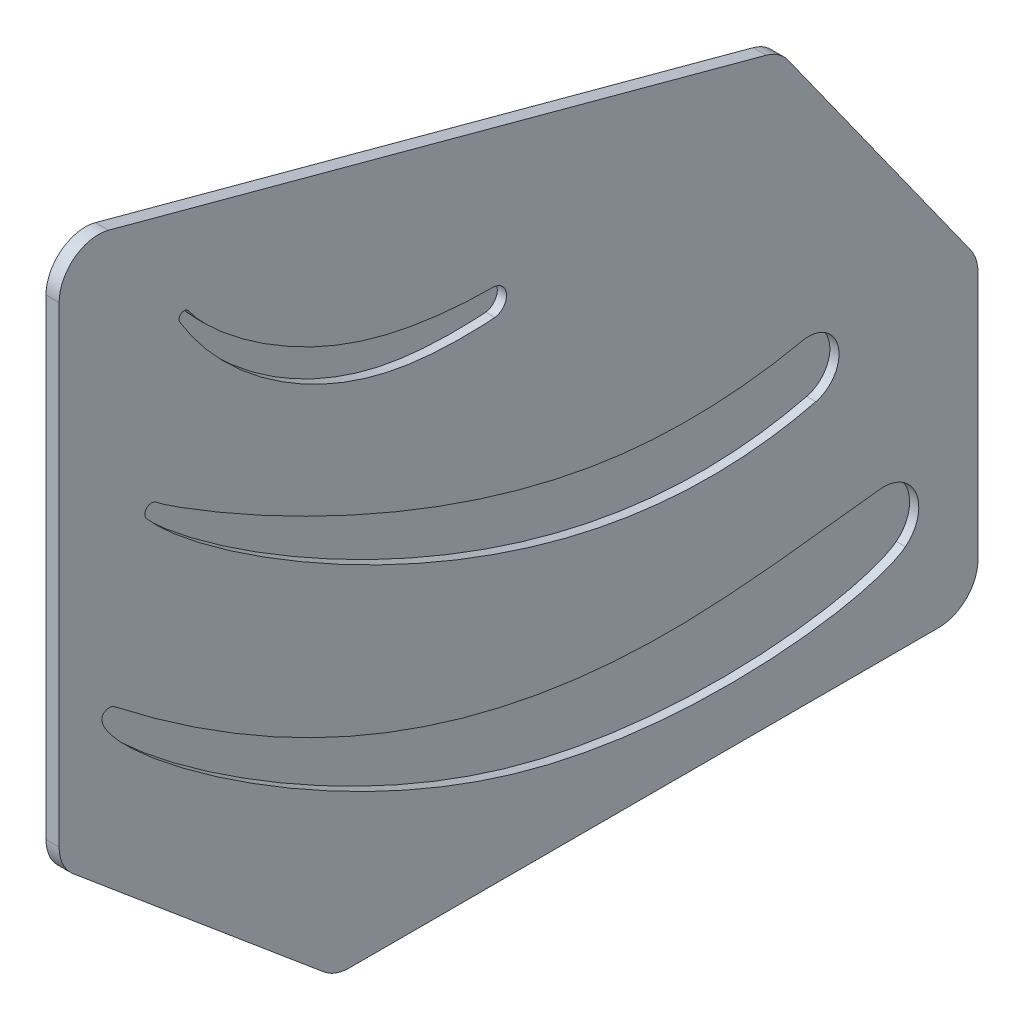
ISO-10303-21;
HEADER;
FILE_DESCRIPTION(('STEP AP214'),'2;1');
FILE_NAME('part.step','',(''),(''),'','','');
FILE_SCHEMA(('AUTOMOTIVE_DESIGN { 1 0 10303 214 1 1 1 1 }'));
ENDSEC;
DATA;
#1=APPLICATION_CONTEXT('core data for automotive mechanical design processes');
#2=APPLICATION_PROTOCOL_DEFINITION('international standard','automotive_design',2000,#1);
#3=PRODUCT_CONTEXT('',#1,'mechanical');
#4=PRODUCT('Part','Part','',(#3));
#5=PRODUCT_RELATED_PRODUCT_CATEGORY('part','',(#4));
#6=PRODUCT_DEFINITION_FORMATION('','',#4);
#7=PRODUCT_DEFINITION_CONTEXT('part definition',#1,'design');
#8=PRODUCT_DEFINITION('design','',#6,#7);
#9=PRODUCT_DEFINITION_SHAPE('','',#8);
#10=(LENGTH_UNIT() NAMED_UNIT(*) SI_UNIT(.MILLI.,.METRE.));
#11=(NAMED_UNIT(*) PLANE_ANGLE_UNIT() SI_UNIT($,.RADIAN.));
#12=(NAMED_UNIT(*) SI_UNIT($,.STERADIAN.) SOLID_ANGLE_UNIT());
#13=UNCERTAINTY_MEASURE_WITH_UNIT(LENGTH_MEASURE(1.E-05),#10,'distance_accuracy_value','');
#14=(GEOMETRIC_REPRESENTATION_CONTEXT(3) GLOBAL_UNCERTAINTY_ASSIGNED_CONTEXT((#13)) GLOBAL_UNIT_ASSIGNED_CONTEXT((#10,
#11,#12)) REPRESENTATION_CONTEXT('',''));
#15=CARTESIAN_POINT('',(0.,0.,0.));
#16=DIRECTION('',(0.,0.,1.));
#17=DIRECTION('',(1.,0.,0.));
#18=AXIS2_PLACEMENT_3D('',#15,#16,#17);
#19=CARTESIAN_POINT('',(10.,-174.517122226006,-532.073894018374));
#20=DIRECTION('',(-1.,0.,0.));
#21=DIRECTION('',(0.,0.,1.));
#22=AXIS2_PLACEMENT_3D('',#19,#20,#21);
#23=CYLINDRICAL_SURFACE('',#22,30.0000000000001);
#24=CARTESIAN_POINT('',(0.,-174.517122226006,-532.073894018374));
#25=DIRECTION('',(1.,0.,0.));
#26=DIRECTION('',(0.,0.,1.));
#27=AXIS2_PLACEMENT_3D('',#24,#25,#26);
#28=CIRCLE('',#27,30.0000000000001);
#29=CARTESIAN_POINT('',(0.,-157.087470130835,-556.491249072542));
#30=VERTEX_POINT('',#29);
#31=CARTESIAN_POINT('',(0.,-145.551320648023,-539.883012979237));
#32=VERTEX_POINT('',#31);
#33=EDGE_CURVE('E401',#30,#32,#28,.T.);
#34=ORIENTED_EDGE('',*,*,#33,.T.);
#35=DIRECTION('',(-1.,0.,0.));
#36=VECTOR('',#35,1.);
#37=CARTESIAN_POINT('',(10.,-145.551320648023,-539.883012979237));
#38=LINE('',#37,#36);
#39=CARTESIAN_POINT('',(10.,-145.551320648023,-539.883012979237));
#40=VERTEX_POINT('',#39);
#41=EDGE_CURVE('E11',#40,#32,#38,.T.);
#42=ORIENTED_EDGE('',*,*,#41,.F.);
#43=CARTESIAN_POINT('',(10.,-174.517122226006,-532.073894018374));
#44=DIRECTION('',(1.,0.,0.));
#45=DIRECTION('',(0.,0.,1.));
#46=AXIS2_PLACEMENT_3D('',#43,#44,#45);
#47=CIRCLE('',#46,30.0000000000001);
#48=CARTESIAN_POINT('',(10.,-157.087470130835,-556.491249072542));
#49=VERTEX_POINT('',#48);
#50=EDGE_CURVE('E441',#49,#40,#47,.T.);
#51=ORIENTED_EDGE('',*,*,#50,.F.);
#52=DIRECTION('',(-1.,0.,0.));
#53=VECTOR('',#52,1.);
#54=CARTESIAN_POINT('',(10.,-157.087470130835,-556.491249072542));
#55=LINE('',#54,#53);
#56=EDGE_CURVE('E442',#49,#30,#55,.T.);
#57=ORIENTED_EDGE('',*,*,#56,.T.);
#58=EDGE_LOOP('',(#34,#42,#51,#57));
#59=FACE_BOUND('',#58,.T.);
#60=ADVANCED_FACE('F39',(#59),#23,.T.);
#61=CARTESIAN_POINT('',(10.,-145.551320648023,-539.883012979237));
#62=DIRECTION('',(0.,-0.965526719266104,0.260303965362101));
#63=DIRECTION('',(0.,-0.260303965362101,-0.965526719266104));
#64=AXIS2_PLACEMENT_3D('',#61,#62,#63);
#65=PLANE('',#64);
#66=DIRECTION('',(0.,0.260303965362101,0.965526719266104));
#67=VECTOR('',#66,1.);
#68=CARTESIAN_POINT('',(0.,-145.551320648023,-539.883012979237));
#69=LINE('',#68,#67);
#70=CARTESIAN_POINT('',(0.,-10.1932586597301,-37.8091189608631));
#71=VERTEX_POINT('',#70);
#72=EDGE_CURVE('E392',#32,#71,#69,.T.);
#73=ORIENTED_EDGE('',*,*,#72,.T.);
#74=DIRECTION('',(-1.,0.,0.));
#75=VECTOR('',#74,1.);
#76=CARTESIAN_POINT('',(10.,-10.1932586597301,-37.8091189608631));
#77=LINE('',#76,#75);
#78=CARTESIAN_POINT('',(10.,-10.1932586597301,-37.8091189608631));
#79=VERTEX_POINT('',#78);
#80=EDGE_CURVE('E47',#79,#71,#77,.T.);
#81=ORIENTED_EDGE('',*,*,#80,.F.);
#82=DIRECTION('',(0.,0.260303965362101,0.965526719266104));
#83=VECTOR('',#82,1.);
#84=CARTESIAN_POINT('',(10.,-145.551320648023,-539.883012979237));
#85=LINE('',#84,#83);
#86=EDGE_CURVE('E492',#40,#79,#85,.T.);
#87=ORIENTED_EDGE('',*,*,#86,.F.);
#88=ORIENTED_EDGE('',*,*,#41,.T.);
#89=EDGE_LOOP('',(#73,#81,#87,#88));
#90=FACE_BOUND('',#89,.T.);
#91=ADVANCED_FACE('F383',(#90),#65,.F.);
#92=CARTESIAN_POINT('',(10.,-39.1590602377132,-30.));
#93=DIRECTION('',(-1.,0.,0.));
#94=DIRECTION('',(0.,0.,1.));
#95=AXIS2_PLACEMENT_3D('',#92,#93,#94);
#96=CYLINDRICAL_SURFACE('',#95,30.);
#97=CARTESIAN_POINT('',(0.,-39.1590602377132,-30.));
#98=DIRECTION('',(1.,0.,0.));
#99=DIRECTION('',(0.,0.,1.));
#100=AXIS2_PLACEMENT_3D('',#97,#98,#99);
#101=CIRCLE('',#100,30.);
#102=CARTESIAN_POINT('',(0.,-39.1590602377132,0.));
#103=VERTEX_POINT('',#102);
#104=EDGE_CURVE('E400',#71,#103,#101,.T.);
#105=ORIENTED_EDGE('',*,*,#104,.T.);
#106=DIRECTION('',(-1.,0.,0.));
#107=VECTOR('',#106,1.);
#108=CARTESIAN_POINT('',(10.,-39.1590602377132,0.));
#109=LINE('',#108,#107);
#110=CARTESIAN_POINT('',(10.,-39.1590602377132,0.));
#111=VERTEX_POINT('',#110);
#112=EDGE_CURVE('E407',#111,#103,#109,.T.);
#113=ORIENTED_EDGE('',*,*,#112,.F.);
#114=CARTESIAN_POINT('',(10.,-39.1590602377132,-30.));
#115=DIRECTION('',(1.,0.,0.));
#116=DIRECTION('',(0.,0.,1.));
#117=AXIS2_PLACEMENT_3D('',#114,#115,#116);
#118=CIRCLE('',#117,30.);
#119=EDGE_CURVE('E405',#79,#111,#118,.T.);
#120=ORIENTED_EDGE('',*,*,#119,.F.);
#121=ORIENTED_EDGE('',*,*,#80,.T.);
#122=EDGE_LOOP('',(#105,#113,#120,#121));
#123=FACE_BOUND('',#122,.T.);
#124=ADVANCED_FACE('F380',(#123),#96,.T.);
#125=CARTESIAN_POINT('',(10.,-39.1590602377132,0.));
#126=DIRECTION('',(0.,0.,-1.));
#127=DIRECTION('',(0.,1.,0.));
#128=AXIS2_PLACEMENT_3D('',#125,#126,#127);
#129=PLANE('',#128);
#130=DIRECTION('',(0.,-1.,0.));
#131=VECTOR('',#130,1.);
#132=CARTESIAN_POINT('',(0.,-39.1590602377132,0.));
#133=LINE('',#132,#131);
#134=CARTESIAN_POINT('',(0.,-399.159060237713,0.));
#135=VERTEX_POINT('',#134);
#136=EDGE_CURVE('E410',#103,#135,#133,.T.);
#137=ORIENTED_EDGE('',*,*,#136,.T.);
#138=DIRECTION('',(-1.,0.,0.));
#139=VECTOR('',#138,1.);
#140=CARTESIAN_POINT('',(10.,-399.159060237713,0.));
#141=LINE('',#140,#139);
#142=CARTESIAN_POINT('',(10.,-399.159060237713,0.));
#143=VERTEX_POINT('',#142);
#144=EDGE_CURVE('E475',#143,#135,#141,.T.);
#145=ORIENTED_EDGE('',*,*,#144,.F.);
#146=DIRECTION('',(0.,-1.,0.));
#147=VECTOR('',#146,1.);
#148=CARTESIAN_POINT('',(10.,-39.1590602377132,0.));
#149=LINE('',#148,#147);
#150=EDGE_CURVE('E482',#111,#143,#149,.T.);
#151=ORIENTED_EDGE('',*,*,#150,.F.);
#152=ORIENTED_EDGE('',*,*,#112,.T.);
#153=EDGE_LOOP('',(#137,#145,#151,#152));
#154=FACE_BOUND('',#153,.T.);
#155=ADVANCED_FACE('F376',(#154),#129,.F.);
#156=CARTESIAN_POINT('',(10.,-399.159060237713,-29.9999999999999));
#157=DIRECTION('',(-1.,0.,0.));
#158=DIRECTION('',(0.,0.,1.));
#159=AXIS2_PLACEMENT_3D('',#156,#157,#158);
#160=CYLINDRICAL_SURFACE('',#159,30.);
#161=CARTESIAN_POINT('',(0.,-399.159060237713,-29.9999999999999));
#162=DIRECTION('',(1.,0.,0.));
#163=DIRECTION('',(0.,0.,1.));
#164=AXIS2_PLACEMENT_3D('',#161,#162,#163);
#165=CIRCLE('',#164,30.);
#166=CARTESIAN_POINT('',(0.,-422.140393531283,-10.7163717094038));
#167=VERTEX_POINT('',#166);
#168=EDGE_CURVE('E414',#135,#167,#165,.T.);
#169=ORIENTED_EDGE('',*,*,#168,.T.);
#170=DIRECTION('',(-1.,0.,0.));
#171=VECTOR('',#170,1.);
#172=CARTESIAN_POINT('',(10.,-422.140393531283,-10.7163717094038));
#173=LINE('',#172,#171);
#174=CARTESIAN_POINT('',(10.,-422.140393531283,-10.7163717094038));
#175=VERTEX_POINT('',#174);
#176=EDGE_CURVE('E471',#175,#167,#173,.T.);
#177=ORIENTED_EDGE('',*,*,#176,.F.);
#178=CARTESIAN_POINT('',(10.,-399.159060237713,-29.9999999999999));
#179=DIRECTION('',(1.,0.,0.));
#180=DIRECTION('',(0.,0.,1.));
#181=AXIS2_PLACEMENT_3D('',#178,#179,#180);
#182=CIRCLE('',#181,30.);
#183=EDGE_CURVE('E486',#143,#175,#182,.T.);
#184=ORIENTED_EDGE('',*,*,#183,.F.);
#185=ORIENTED_EDGE('',*,*,#144,.T.);
#186=EDGE_LOOP('',(#169,#177,#184,#185));
#187=FACE_BOUND('',#186,.T.);
#188=ADVANCED_FACE('F372',(#187),#160,.T.);
#189=CARTESIAN_POINT('',(10.,-422.140393531283,-10.7163717094038));
#190=DIRECTION('',(0.,0.76604444311898,-0.642787609686537));
#191=DIRECTION('',(0.,0.642787609686537,0.76604444311898));
#192=AXIS2_PLACEMENT_3D('',#189,#190,#191);
#193=PLANE('',#192);
#194=DIRECTION('',(0.,-0.642787609686537,-0.76604444311898));
#195=VECTOR('',#194,1.);
#196=CARTESIAN_POINT('',(0.,-422.140393531283,-10.7163717094038));
#197=LINE('',#196,#195);
#198=CARTESIAN_POINT('',(0.,-582.837295952917,-202.227482489149));
#199=VERTEX_POINT('',#198);
#200=EDGE_CURVE('E420',#167,#199,#197,.T.);
#201=ORIENTED_EDGE('',*,*,#200,.T.);
#202=DIRECTION('',(-1.,0.,0.));
#203=VECTOR('',#202,1.);
#204=CARTESIAN_POINT('',(10.,-582.837295952917,-202.227482489149));
#205=LINE('',#204,#203);
#206=CARTESIAN_POINT('',(10.,-582.837295952917,-202.227482489149));
#207=VERTEX_POINT('',#206);
#208=EDGE_CURVE('E467',#207,#199,#205,.T.);
#209=ORIENTED_EDGE('',*,*,#208,.F.);
#210=DIRECTION('',(0.,-0.642787609686537,-0.76604444311898));
#211=VECTOR('',#210,1.);
#212=CARTESIAN_POINT('',(10.,-422.140393531283,-10.7163717094038));
#213=LINE('',#212,#211);
#214=EDGE_CURVE('E490',#175,#207,#213,.T.);
#215=ORIENTED_EDGE('',*,*,#214,.F.);
#216=ORIENTED_EDGE('',*,*,#176,.T.);
#217=EDGE_LOOP('',(#201,#209,#215,#216));
#218=FACE_BOUND('',#217,.T.);
#219=ADVANCED_FACE('F368',(#218),#193,.F.);
#220=CARTESIAN_POINT('',(10.,-559.855962659348,-221.511110779745));
#221=DIRECTION('',(-1.,0.,0.));
#222=DIRECTION('',(0.,0.,1.));
#223=AXIS2_PLACEMENT_3D('',#220,#221,#222);
#224=CYLINDRICAL_SURFACE('',#223,30.);
#225=CARTESIAN_POINT('',(0.,-559.855962659348,-221.511110779745));
#226=DIRECTION('',(1.,0.,0.));
#227=DIRECTION('',(0.,0.,1.));
#228=AXIS2_PLACEMENT_3D('',#225,#226,#227);
#229=CIRCLE('',#228,30.);
#230=CARTESIAN_POINT('',(0.,-589.855962659348,-221.511110779745));
#231=VERTEX_POINT('',#230);
#232=EDGE_CURVE('E423',#199,#231,#229,.T.);
#233=ORIENTED_EDGE('',*,*,#232,.T.);
#234=DIRECTION('',(-1.,0.,0.));
#235=VECTOR('',#234,1.);
#236=CARTESIAN_POINT('',(10.,-589.855962659348,-221.511110779745));
#237=LINE('',#236,#235);
#238=CARTESIAN_POINT('',(10.,-589.855962659348,-221.511110779745));
#239=VERTEX_POINT('',#238);
#240=EDGE_CURVE('E463',#239,#231,#237,.T.);
#241=ORIENTED_EDGE('',*,*,#240,.F.);
#242=CARTESIAN_POINT('',(10.,-559.855962659348,-221.511110779745));
#243=DIRECTION('',(1.,0.,0.));
#244=DIRECTION('',(0.,0.,1.));
#245=AXIS2_PLACEMENT_3D('',#242,#243,#244);
#246=CIRCLE('',#245,30.);
#247=EDGE_CURVE('E498',#207,#239,#246,.T.);
#248=ORIENTED_EDGE('',*,*,#247,.F.);
#249=ORIENTED_EDGE('',*,*,#208,.T.);
#250=EDGE_LOOP('',(#233,#241,#248,#249));
#251=FACE_BOUND('',#250,.T.);
#252=ADVANCED_FACE('F364',(#251),#224,.T.);
#253=CARTESIAN_POINT('',(10.,-589.855962659348,-221.511110779745));
#254=DIRECTION('',(0.,1.,0.));
#255=DIRECTION('',(0.,0.,1.));
#256=AXIS2_PLACEMENT_3D('',#253,#254,#255);
#257=PLANE('',#256);
#258=DIRECTION('',(0.,0.,-1.));
#259=VECTOR('',#258,1.);
#260=CARTESIAN_POINT('',(0.,-589.855962659348,-221.511110779745));
#261=LINE('',#260,#259);
#262=CARTESIAN_POINT('',(0.,-589.855962659348,-671.511110779745));
#263=VERTEX_POINT('',#262);
#264=EDGE_CURVE('E426',#231,#263,#261,.T.);
#265=ORIENTED_EDGE('',*,*,#264,.T.);
#266=DIRECTION('',(-1.,0.,0.));
#267=VECTOR('',#266,1.);
#268=CARTESIAN_POINT('',(10.,-589.855962659348,-671.511110779745));
#269=LINE('',#268,#267);
#270=CARTESIAN_POINT('',(10.,-589.855962659348,-671.511110779745));
#271=VERTEX_POINT('',#270);
#272=EDGE_CURVE('E459',#271,#263,#269,.T.);
#273=ORIENTED_EDGE('',*,*,#272,.F.);
#274=DIRECTION('',(0.,0.,-1.));
#275=VECTOR('',#274,1.);
#276=CARTESIAN_POINT('',(10.,-589.855962659348,-221.511110779745));
#277=LINE('',#276,#275);
#278=EDGE_CURVE('E501',#239,#271,#277,.T.);
#279=ORIENTED_EDGE('',*,*,#278,.F.);
#280=ORIENTED_EDGE('',*,*,#240,.T.);
#281=EDGE_LOOP('',(#265,#273,#279,#280));
#282=FACE_BOUND('',#281,.T.);
#283=ADVANCED_FACE('F360',(#282),#257,.F.);
#284=CARTESIAN_POINT('',(10.,-559.855962659348,-671.511110779745));
#285=DIRECTION('',(-1.,0.,0.));
#286=DIRECTION('',(0.,0.,1.));
#287=AXIS2_PLACEMENT_3D('',#284,#285,#286);
#288=CYLINDRICAL_SURFACE('',#287,30.0000000000001);
#289=CARTESIAN_POINT('',(0.,-559.855962659348,-671.511110779745));
#290=DIRECTION('',(1.,0.,0.));
#291=DIRECTION('',(0.,0.,1.));
#292=AXIS2_PLACEMENT_3D('',#289,#290,#291);
#293=CIRCLE('',#292,30.0000000000001);
#294=CARTESIAN_POINT('',(0.,-559.855962659348,-701.511110779745));
#295=VERTEX_POINT('',#294);
#296=EDGE_CURVE('E429',#263,#295,#293,.T.);
#297=ORIENTED_EDGE('',*,*,#296,.T.);
#298=DIRECTION('',(-1.,0.,0.));
#299=VECTOR('',#298,1.);
#300=CARTESIAN_POINT('',(10.,-559.855962659348,-701.511110779745));
#301=LINE('',#300,#299);
#302=CARTESIAN_POINT('',(10.,-559.855962659348,-701.511110779745));
#303=VERTEX_POINT('',#302);
#304=EDGE_CURVE('E455',#303,#295,#301,.T.);
#305=ORIENTED_EDGE('',*,*,#304,.F.);
#306=CARTESIAN_POINT('',(10.,-559.855962659348,-671.511110779745));
#307=DIRECTION('',(1.,0.,0.));
#308=DIRECTION('',(0.,0.,1.));
#309=AXIS2_PLACEMENT_3D('',#306,#307,#308);
#310=CIRCLE('',#309,30.0000000000001);
#311=EDGE_CURVE('E504',#271,#303,#310,.T.);
#312=ORIENTED_EDGE('',*,*,#311,.F.);
#313=ORIENTED_EDGE('',*,*,#272,.T.);
#314=EDGE_LOOP('',(#297,#305,#312,#313));
#315=FACE_BOUND('',#314,.T.);
#316=ADVANCED_FACE('F356',(#315),#288,.T.);
#317=CARTESIAN_POINT('',(10.,-559.855962659348,-701.511110779745));
#318=DIRECTION('',(0.,0.,1.));
#319=DIRECTION('',(0.,-1.,0.));
#320=AXIS2_PLACEMENT_3D('',#317,#318,#319);
#321=PLANE('',#320);
#322=DIRECTION('',(0.,1.,0.));
#323=VECTOR('',#322,1.);
#324=CARTESIAN_POINT('',(0.,-559.855962659348,-701.511110779745));
#325=LINE('',#324,#323);
#326=CARTESIAN_POINT('',(0.,-369.855962659348,-701.511110779745));
#327=VERTEX_POINT('',#326);
#328=EDGE_CURVE('E432',#295,#327,#325,.T.);
#329=ORIENTED_EDGE('',*,*,#328,.T.);
#330=DIRECTION('',(-1.,0.,0.));
#331=VECTOR('',#330,1.);
#332=CARTESIAN_POINT('',(10.,-369.855962659348,-701.511110779745));
#333=LINE('',#332,#331);
#334=CARTESIAN_POINT('',(10.,-369.855962659348,-701.511110779745));
#335=VERTEX_POINT('',#334);
#336=EDGE_CURVE('E451',#335,#327,#333,.T.);
#337=ORIENTED_EDGE('',*,*,#336,.F.);
#338=DIRECTION('',(0.,1.,0.));
#339=VECTOR('',#338,1.);
#340=CARTESIAN_POINT('',(10.,-559.855962659348,-701.511110779745));
#341=LINE('',#340,#339);
#342=EDGE_CURVE('E507',#303,#335,#341,.T.);
#343=ORIENTED_EDGE('',*,*,#342,.F.);
#344=ORIENTED_EDGE('',*,*,#304,.T.);
#345=EDGE_LOOP('',(#329,#337,#343,#344));
#346=FACE_BOUND('',#345,.T.);
#347=ADVANCED_FACE('F352',(#346),#321,.F.);
#348=CARTESIAN_POINT('',(10.,-369.855962659348,-671.511110779745));
#349=DIRECTION('',(-1.,0.,0.));
#350=DIRECTION('',(0.,0.,1.));
#351=AXIS2_PLACEMENT_3D('',#348,#349,#350);
#352=CYLINDRICAL_SURFACE('',#351,30.);
#353=CARTESIAN_POINT('',(0.,-369.855962659348,-671.511110779745));
#354=DIRECTION('',(1.,0.,0.));
#355=DIRECTION('',(0.,0.,1.));
#356=AXIS2_PLACEMENT_3D('',#353,#354,#355);
#357=CIRCLE('',#356,30.);
#358=CARTESIAN_POINT('',(0.,-352.426310564176,-695.928465833913));
#359=VERTEX_POINT('',#358);
#360=EDGE_CURVE('E435',#327,#359,#357,.T.);
#361=ORIENTED_EDGE('',*,*,#360,.T.);
#362=DIRECTION('',(-1.,0.,0.));
#363=VECTOR('',#362,1.);
#364=CARTESIAN_POINT('',(10.,-352.426310564176,-695.928465833913));
#365=LINE('',#364,#363);
#366=CARTESIAN_POINT('',(10.,-352.426310564176,-695.928465833913));
#367=VERTEX_POINT('',#366);
#368=EDGE_CURVE('E446',#367,#359,#365,.T.);
#369=ORIENTED_EDGE('',*,*,#368,.F.);
#370=CARTESIAN_POINT('',(10.,-369.855962659348,-671.511110779745));
#371=DIRECTION('',(1.,0.,0.));
#372=DIRECTION('',(0.,0.,1.));
#373=AXIS2_PLACEMENT_3D('',#370,#371,#372);
#374=CIRCLE('',#373,30.);
#375=EDGE_CURVE('E510',#335,#367,#374,.T.);
#376=ORIENTED_EDGE('',*,*,#375,.F.);
#377=ORIENTED_EDGE('',*,*,#336,.T.);
#378=EDGE_LOOP('',(#361,#369,#376,#377));
#379=FACE_BOUND('',#378,.T.);
#380=ADVANCED_FACE('F348',(#379),#352,.T.);
#381=CARTESIAN_POINT('',(10.,-352.426310564176,-695.928465833913));
#382=DIRECTION('',(0.,-0.580988403172377,0.813911835138924));
#383=DIRECTION('',(0.,-0.813911835138924,-0.580988403172377));
#384=AXIS2_PLACEMENT_3D('',#381,#382,#383);
#385=PLANE('',#384);
#386=DIRECTION('',(0.,0.813911835138924,0.580988403172377));
#387=VECTOR('',#386,1.);
#388=CARTESIAN_POINT('',(0.,-352.426310564176,-695.928465833913));
#389=LINE('',#388,#387);
#390=EDGE_CURVE('E438',#359,#30,#389,.T.);
#391=ORIENTED_EDGE('',*,*,#390,.T.);
#392=ORIENTED_EDGE('',*,*,#56,.F.);
#393=DIRECTION('',(0.,0.813911835138924,0.580988403172377));
#394=VECTOR('',#393,1.);
#395=CARTESIAN_POINT('',(10.,-352.426310564176,-695.928465833913));
#396=LINE('',#395,#394);
#397=EDGE_CURVE('E447',#367,#49,#396,.T.);
#398=ORIENTED_EDGE('',*,*,#397,.F.);
#399=ORIENTED_EDGE('',*,*,#368,.T.);
#400=EDGE_LOOP('',(#391,#392,#398,#399));
#401=FACE_BOUND('',#400,.T.);
#402=ADVANCED_FACE('F341',(#401),#385,.F.);
#403=CARTESIAN_POINT('',(10.,-174.517122226006,-532.073894018374));
#404=DIRECTION('',(-1.,0.,0.));
#405=DIRECTION('',(0.,0.,1.));
#406=AXIS2_PLACEMENT_3D('',#403,#404,#405);
#407=PLANE('',#406);
#408=CARTESIAN_POINT('',(10.,-502.589093221436,-629.491772363447));
#409=DIRECTION('',(1.,0.,0.));
#410=DIRECTION('',(0.,0.,-1.));
#411=AXIS2_PLACEMENT_3D('',#408,#409,#410);
#412=CIRCLE('',#411,26.8241570867148);
#413=CARTESIAN_POINT('',(10.,-523.626722446305,-646.133694127765));
#414=VERTEX_POINT('',#413);
#415=CARTESIAN_POINT('',(10.,-475.947865393782,-626.364411935255));
#416=VERTEX_POINT('',#415);
#417=EDGE_CURVE('E281',#414,#416,#412,.T.);
#418=ORIENTED_EDGE('',*,*,#417,.F.);
#419=CARTESIAN_POINT('',(10.,-327.560917885921,-34.2073928975711));
#420=CARTESIAN_POINT('',(10.,-342.918185901168,-14.4757134824389));
#421=CARTESIAN_POINT('',(10.,-589.015611508737,-324.808789115096));
#422=CARTESIAN_POINT('',(10.,-544.090123726999,-620.26520039731));
#423=CARTESIAN_POINT('',(10.,-523.626722446305,-646.133694127765));
#424=B_SPLINE_CURVE_WITH_KNOTS('',3,(#419,#420,#421,#422,#423),.UNSPECIFIED.,.F.,.F.,(4,1,4),
(0.,0.545719306993934,1.),.UNSPECIFIED.);
#425=CARTESIAN_POINT('',(10.,-327.560917885921,-34.2073928975711));
#426=VERTEX_POINT('',#425);
#427=EDGE_CURVE('E54',#426,#414,#424,.T.);
#428=ORIENTED_EDGE('',*,*,#427,.F.);
#429=CARTESIAN_POINT('',(10.,-332.821595277872,-38.3018052864112));
#430=DIRECTION('',(1.,0.,0.));
#431=DIRECTION('',(0.,0.,-1.));
#432=AXIS2_PLACEMENT_3D('',#429,#430,#431);
#433=CIRCLE('',#432,6.66625377795278);
#434=CARTESIAN_POINT('',(10.,-327.560917885921,-42.3962176752514));
#435=VERTEX_POINT('',#434);
#436=EDGE_CURVE('E295',#435,#426,#433,.T.);
#437=ORIENTED_EDGE('',*,*,#436,.F.);
#438=CARTESIAN_POINT('',(10.,-475.947865393782,-626.364411935255));
#439=CARTESIAN_POINT('',(10.,-482.27942538639,-572.427382244999));
#440=CARTESIAN_POINT('',(10.,-510.067463813898,-369.496171973337));
#441=CARTESIAN_POINT('',(10.,-434.657283692067,-179.998241323893));
#442=CARTESIAN_POINT('',(10.,-327.560917885921,-42.3962176752514));
#443=B_SPLINE_CURVE_WITH_KNOTS('',3,(#438,#439,#440,#441,#442),.UNSPECIFIED.,.F.,.F.,(4,1,4),
(0.,0.257311007097381,1.),.UNSPECIFIED.);
#444=EDGE_CURVE('E289',#416,#435,#443,.T.);
#445=ORIENTED_EDGE('',*,*,#444,.F.);
#446=EDGE_LOOP('',(#418,#428,#437,#445));
#447=FACE_BOUND('',#446,.T.);
#448=CARTESIAN_POINT('',(10.,-212.017093403613,-70.6350047953519));
#449=DIRECTION('',(1.,0.,0.));
#450=DIRECTION('',(0.,0.,-1.));
#451=AXIS2_PLACEMENT_3D('',#448,#449,#450);
#452=CIRCLE('',#451,5.16343894993929);
#453=CARTESIAN_POINT('',(10.,-208.284508838147,-74.2027651924913));
#454=VERTEX_POINT('',#453);
#455=CARTESIAN_POINT('',(10.,-215.359019498053,-66.6989367358474));
#456=VERTEX_POINT('',#455);
#457=EDGE_CURVE('E731',#454,#456,#452,.T.);
#458=ORIENTED_EDGE('',*,*,#457,.F.);
#459=CARTESIAN_POINT('',(10.,-348.175125637554,-567.085033992223));
#460=CARTESIAN_POINT('',(10.,-357.109499900645,-526.742508557986));
#461=CARTESIAN_POINT('',(10.,-369.790908175434,-316.076431581436));
#462=CARTESIAN_POINT('',(10.,-214.924232146977,-81.1492318782514));
#463=CARTESIAN_POINT('',(10.,-208.284508838147,-74.2027651924913));
#464=B_SPLINE_CURVE_WITH_KNOTS('',3,(#459,#460,#461,#462,#463),.UNSPECIFIED.,.F.,.F.,(4,1,4),
(0.,0.231564943098002,1.),.UNSPECIFIED.);
#465=CARTESIAN_POINT('',(10.,-348.175125637554,-567.085033992223));
#466=VERTEX_POINT('',#465);
#467=EDGE_CURVE('E62',#466,#454,#464,.T.);
#468=ORIENTED_EDGE('',*,*,#467,.F.);
#469=CARTESIAN_POINT('',(10.,-370.921108440947,-572.122426202053));
#470=DIRECTION('',(1.,0.,0.));
#471=DIRECTION('',(0.,0.,-1.));
#472=AXIS2_PLACEMENT_3D('',#469,#470,#471);
#473=CIRCLE('',#472,23.2971039824244);
#474=CARTESIAN_POINT('',(10.,-393.526935767269,-577.755509270889));
#475=VERTEX_POINT('',#474);
#476=EDGE_CURVE('E223',#475,#466,#473,.T.);
#477=ORIENTED_EDGE('',*,*,#476,.F.);
#478=CARTESIAN_POINT('',(10.,-215.359019498053,-66.6989367358474));
#479=CARTESIAN_POINT('',(10.,-254.957400327833,-100.32001751799));
#480=CARTESIAN_POINT('',(10.,-390.035120939274,-300.322217314818));
#481=CARTESIAN_POINT('',(10.,-410.500517765273,-509.639726303154));
#482=CARTESIAN_POINT('',(10.,-393.526935767269,-577.755509270889));
#483=B_SPLINE_CURVE_WITH_KNOTS('',3,(#478,#479,#480,#481,#482),.UNSPECIFIED.,.F.,.F.,(4,1,4),
(0.,0.654710404601049,1.),.UNSPECIFIED.);
#484=EDGE_CURVE('E227',#456,#475,#483,.T.);
#485=ORIENTED_EDGE('',*,*,#484,.F.);
#486=EDGE_LOOP('',(#458,#468,#477,#485));
#487=FACE_BOUND('',#486,.T.);
#488=CARTESIAN_POINT('',(10.,-205.077593488352,-331.180679607639));
#489=DIRECTION('',(1.,0.,0.));
#490=DIRECTION('',(0.,0.,-1.));
#491=AXIS2_PLACEMENT_3D('',#488,#489,#490);
#492=CIRCLE('',#491,10.3921258794981);
#493=CARTESIAN_POINT('',(10.,-215.359019498053,-332.693478173995));
#494=VERTEX_POINT('',#493);
#495=CARTESIAN_POINT('',(10.,-194.685467652383,-331.179728440837));
#496=VERTEX_POINT('',#495);
#497=EDGE_CURVE('E580',#494,#496,#492,.T.);
#498=ORIENTED_EDGE('',*,*,#497,.F.);
#499=CARTESIAN_POINT('',(10.,-98.1982205957029,-92.1634139046647));
#500=CARTESIAN_POINT('',(10.,-154.802617957198,-126.325036043108));
#501=CARTESIAN_POINT('',(10.,-224.562098264762,-226.918714052244));
#502=CARTESIAN_POINT('',(10.,-215.472572373609,-331.921739282793));
#503=CARTESIAN_POINT('',(10.,-215.359019498053,-332.693478173995));
#504=B_SPLINE_CURVE_WITH_KNOTS('',3,(#499,#500,#501,#502,#503),.UNSPECIFIED.,.F.,.F.,(4,1,4),
(0.,0.645739258676311,1.),.UNSPECIFIED.);
#505=CARTESIAN_POINT('',(10.,-98.1982205957029,-92.1634139046647));
#506=VERTEX_POINT('',#505);
#507=EDGE_CURVE('E306',#506,#494,#504,.T.);
#508=ORIENTED_EDGE('',*,*,#507,.F.);
#509=CARTESIAN_POINT('',(10.,-96.1610640225741,-95.5388982328283));
#510=DIRECTION('',(1.,0.,0.));
#511=DIRECTION('',(0.,0.,-1.));
#512=AXIS2_PLACEMENT_3D('',#509,#510,#511);
#513=CIRCLE('',#512,3.94257547208935);
#514=CARTESIAN_POINT('',(10.,-93.9889301215881,-98.8291468053997));
#515=VERTEX_POINT('',#514);
#516=EDGE_CURVE('E323',#515,#506,#513,.T.);
#517=ORIENTED_EDGE('',*,*,#516,.F.);
#518=CARTESIAN_POINT('',(10.,-194.685467652383,-331.179728440837));
#519=CARTESIAN_POINT('',(10.,-194.688304583207,-300.184384568456));
#520=CARTESIAN_POINT('',(10.,-182.137837809804,-192.730208887923));
#521=CARTESIAN_POINT('',(10.,-114.882858950243,-112.622758483207));
#522=CARTESIAN_POINT('',(10.,-93.9889301215881,-98.8291468053997));
#523=B_SPLINE_CURVE_WITH_KNOTS('',3,(#518,#519,#520,#521,#522),.UNSPECIFIED.,.F.,.F.,(4,1,4),
(0.,0.339117248362669,1.),.UNSPECIFIED.);
#524=EDGE_CURVE('E585',#496,#515,#523,.T.);
#525=ORIENTED_EDGE('',*,*,#524,.F.);
#526=EDGE_LOOP('',(#498,#508,#517,#525));
#527=FACE_BOUND('',#526,.T.);
#528=ORIENTED_EDGE('',*,*,#50,.T.);
#529=ORIENTED_EDGE('',*,*,#86,.T.);
#530=ORIENTED_EDGE('',*,*,#119,.T.);
#531=ORIENTED_EDGE('',*,*,#150,.T.);
#532=ORIENTED_EDGE('',*,*,#183,.T.);
#533=ORIENTED_EDGE('',*,*,#214,.T.);
#534=ORIENTED_EDGE('',*,*,#247,.T.);
#535=ORIENTED_EDGE('',*,*,#278,.T.);
#536=ORIENTED_EDGE('',*,*,#311,.T.);
#537=ORIENTED_EDGE('',*,*,#342,.T.);
#538=ORIENTED_EDGE('',*,*,#375,.T.);
#539=ORIENTED_EDGE('',*,*,#397,.T.);
#540=EDGE_LOOP('',(#528,#529,#530,#531,#532,#533,#534,#535,#536,#537,#538,#539));
#541=FACE_BOUND('',#540,.T.);
#542=ADVANCED_FACE('F338',(#447,#487,#527,#541),#407,.F.);
#543=CARTESIAN_POINT('',(0.,-174.517122226006,-532.073894018374));
#544=DIRECTION('',(-1.,0.,0.));
#545=DIRECTION('',(0.,0.,1.));
#546=AXIS2_PLACEMENT_3D('',#543,#544,#545);
#547=PLANE('',#546);
#548=ORIENTED_EDGE('',*,*,#33,.F.);
#549=ORIENTED_EDGE('',*,*,#390,.F.);
#550=ORIENTED_EDGE('',*,*,#360,.F.);
#551=ORIENTED_EDGE('',*,*,#328,.F.);
#552=ORIENTED_EDGE('',*,*,#296,.F.);
#553=ORIENTED_EDGE('',*,*,#264,.F.);
#554=ORIENTED_EDGE('',*,*,#232,.F.);
#555=ORIENTED_EDGE('',*,*,#200,.F.);
#556=ORIENTED_EDGE('',*,*,#168,.F.);
#557=ORIENTED_EDGE('',*,*,#136,.F.);
#558=ORIENTED_EDGE('',*,*,#104,.F.);
#559=ORIENTED_EDGE('',*,*,#72,.F.);
#560=EDGE_LOOP('',(#548,#549,#550,#551,#552,#553,#554,#555,#556,#557,#558,#559));
#561=FACE_BOUND('',#560,.T.);
#562=ADVANCED_FACE('F334',(#561),#547,.T.);
#563=CARTESIAN_POINT('',(3.,-98.1982205957029,-92.1634139046647));
#564=CARTESIAN_POINT('',(3.,-154.802617957198,-126.325036043108));
#565=CARTESIAN_POINT('',(3.,-224.562098264762,-226.918714052244));
#566=CARTESIAN_POINT('',(3.,-215.472572373609,-331.921739282793));
#567=CARTESIAN_POINT('',(3.,-215.359019498053,-332.693478173995));
#568=B_SPLINE_CURVE_WITH_KNOTS('',3,(#563,#564,#565,#566,#567),.UNSPECIFIED.,.F.,.F.,(4,1,4),
(0.,0.645739258676311,1.),.UNSPECIFIED.);
#569=DIRECTION('',(1.,0.,0.));
#570=VECTOR('',#569,1.);
#571=SURFACE_OF_LINEAR_EXTRUSION('',#568,#570);
#572=ORIENTED_EDGE('',*,*,#507,.T.);
#573=DIRECTION('',(1.,0.,0.));
#574=VECTOR('',#573,1.);
#575=CARTESIAN_POINT('',(3.,-215.359019498053,-332.693478173995));
#576=LINE('',#575,#574);
#577=CARTESIAN_POINT('',(3.,-215.359019498053,-332.693478173995));
#578=VERTEX_POINT('',#577);
#579=EDGE_CURVE('E529',#578,#494,#576,.T.);
#580=ORIENTED_EDGE('',*,*,#579,.F.);
#581=CARTESIAN_POINT('',(3.,-98.1982205957029,-92.1634139046647));
#582=VERTEX_POINT('',#581);
#583=EDGE_CURVE('E315',#582,#578,#568,.T.);
#584=ORIENTED_EDGE('',*,*,#583,.F.);
#585=DIRECTION('',(1.,0.,0.));
#586=VECTOR('',#585,1.);
#587=CARTESIAN_POINT('',(3.,-98.1982205957029,-92.1634139046647));
#588=LINE('',#587,#586);
#589=EDGE_CURVE('E515',#582,#506,#588,.T.);
#590=ORIENTED_EDGE('',*,*,#589,.T.);
#591=EDGE_LOOP('',(#572,#580,#584,#590));
#592=FACE_BOUND('',#591,.T.);
#593=ADVANCED_FACE('F329',(#592),#571,.F.);
#594=CARTESIAN_POINT('',(3.,-96.1610640225741,-95.5388982328283));
#595=DIRECTION('',(1.,0.,0.));
#596=DIRECTION('',(0.,0.,-1.));
#597=AXIS2_PLACEMENT_3D('',#594,#595,#596);
#598=CYLINDRICAL_SURFACE('',#597,3.94257547208935);
#599=ORIENTED_EDGE('',*,*,#516,.T.);
#600=ORIENTED_EDGE('',*,*,#589,.F.);
#601=CARTESIAN_POINT('',(3.,-96.1610640225741,-95.5388982328283));
#602=DIRECTION('',(1.,0.,0.));
#603=DIRECTION('',(0.,0.,-1.));
#604=AXIS2_PLACEMENT_3D('',#601,#602,#603);
#605=CIRCLE('',#604,3.94257547208935);
#606=CARTESIAN_POINT('',(3.,-93.9889301215881,-98.8291468053997));
#607=VERTEX_POINT('',#606);
#608=EDGE_CURVE('E533',#607,#582,#605,.T.);
#609=ORIENTED_EDGE('',*,*,#608,.F.);
#610=DIRECTION('',(1.,0.,0.));
#611=VECTOR('',#610,1.);
#612=CARTESIAN_POINT('',(3.,-93.9889301215881,-98.8291468053997));
#613=LINE('',#612,#611);
#614=EDGE_CURVE('E517',#607,#515,#613,.T.);
#615=ORIENTED_EDGE('',*,*,#614,.T.);
#616=EDGE_LOOP('',(#599,#600,#609,#615));
#617=FACE_BOUND('',#616,.T.);
#618=ADVANCED_FACE('F333',(#617),#598,.F.);
#619=CARTESIAN_POINT('',(3.,-194.685467652383,-331.179728440837));
#620=CARTESIAN_POINT('',(3.,-194.688304583207,-300.184384568456));
#621=CARTESIAN_POINT('',(3.,-182.137837809804,-192.730208887923));
#622=CARTESIAN_POINT('',(3.,-114.882858950243,-112.622758483207));
#623=CARTESIAN_POINT('',(3.,-93.9889301215881,-98.8291468053997));
#624=B_SPLINE_CURVE_WITH_KNOTS('',3,(#619,#620,#621,#622,#623),.UNSPECIFIED.,.F.,.F.,(4,1,4),
(0.,0.339117248362669,1.),.UNSPECIFIED.);
#625=DIRECTION('',(1.,0.,0.));
#626=VECTOR('',#625,1.);
#627=SURFACE_OF_LINEAR_EXTRUSION('',#624,#626);
#628=ORIENTED_EDGE('',*,*,#524,.T.);
#629=ORIENTED_EDGE('',*,*,#614,.F.);
#630=CARTESIAN_POINT('',(3.,-194.685467652383,-331.179728440837));
#631=VERTEX_POINT('',#630);
#632=EDGE_CURVE('E566',#631,#607,#624,.T.);
#633=ORIENTED_EDGE('',*,*,#632,.F.);
#634=DIRECTION('',(1.,0.,0.));
#635=VECTOR('',#634,1.);
#636=CARTESIAN_POINT('',(3.,-194.685467652383,-331.179728440837));
#637=LINE('',#636,#635);
#638=EDGE_CURVE('E522',#631,#496,#637,.T.);
#639=ORIENTED_EDGE('',*,*,#638,.T.);
#640=EDGE_LOOP('',(#628,#629,#633,#639));
#641=FACE_BOUND('',#640,.T.);
#642=ADVANCED_FACE('F608',(#641),#627,.F.);
#643=CARTESIAN_POINT('',(3.,-205.077593488352,-331.180679607639));
#644=DIRECTION('',(1.,0.,0.));
#645=DIRECTION('',(0.,0.,-1.));
#646=AXIS2_PLACEMENT_3D('',#643,#644,#645);
#647=CYLINDRICAL_SURFACE('',#646,10.3921258794981);
#648=ORIENTED_EDGE('',*,*,#497,.T.);
#649=ORIENTED_EDGE('',*,*,#638,.F.);
#650=CARTESIAN_POINT('',(3.,-205.077593488352,-331.180679607639));
#651=DIRECTION('',(1.,0.,0.));
#652=DIRECTION('',(0.,0.,-1.));
#653=AXIS2_PLACEMENT_3D('',#650,#651,#652);
#654=CIRCLE('',#653,10.3921258794981);
#655=EDGE_CURVE('E322',#578,#631,#654,.T.);
#656=ORIENTED_EDGE('',*,*,#655,.F.);
#657=ORIENTED_EDGE('',*,*,#579,.T.);
#658=EDGE_LOOP('',(#648,#649,#656,#657));
#659=FACE_BOUND('',#658,.T.);
#660=ADVANCED_FACE('F336',(#659),#647,.F.);
#661=CARTESIAN_POINT('',(3.,-198.999208225071,-213.465848574366));
#662=DIRECTION('',(-1.,0.,0.));
#663=DIRECTION('',(0.,0.,1.));
#664=AXIS2_PLACEMENT_3D('',#661,#662,#663);
#665=PLANE('',#664);
#666=ORIENTED_EDGE('',*,*,#583,.T.);
#667=ORIENTED_EDGE('',*,*,#655,.T.);
#668=ORIENTED_EDGE('',*,*,#632,.T.);
#669=ORIENTED_EDGE('',*,*,#608,.T.);
#670=EDGE_LOOP('',(#666,#667,#668,#669));
#671=FACE_BOUND('',#670,.T.);
#672=ADVANCED_FACE('F241',(#671),#665,.F.);
#673=CARTESIAN_POINT('',(3.,-348.175125637554,-567.085033992223));
#674=CARTESIAN_POINT('',(3.,-357.109499900645,-526.742508557986));
#675=CARTESIAN_POINT('',(3.,-369.790908175434,-316.076431581436));
#676=CARTESIAN_POINT('',(3.,-214.924232146977,-81.1492318782514));
#677=CARTESIAN_POINT('',(3.,-208.284508838147,-74.2027651924913));
#678=B_SPLINE_CURVE_WITH_KNOTS('',3,(#673,#674,#675,#676,#677),.UNSPECIFIED.,.F.,.F.,(4,1,4),
(0.,0.231564943098002,1.),.UNSPECIFIED.);
#679=DIRECTION('',(1.,0.,0.));
#680=VECTOR('',#679,1.);
#681=SURFACE_OF_LINEAR_EXTRUSION('',#678,#680);
#682=ORIENTED_EDGE('',*,*,#467,.T.);
#683=DIRECTION('',(1.,0.,0.));
#684=VECTOR('',#683,1.);
#685=CARTESIAN_POINT('',(3.,-208.284508838147,-74.2027651924913));
#686=LINE('',#685,#684);
#687=CARTESIAN_POINT('',(3.,-208.284508838147,-74.2027651924913));
#688=VERTEX_POINT('',#687);
#689=EDGE_CURVE('E198',#688,#454,#686,.T.);
#690=ORIENTED_EDGE('',*,*,#689,.F.);
#691=CARTESIAN_POINT('',(3.,-348.175125637554,-567.085033992223));
#692=VERTEX_POINT('',#691);
#693=EDGE_CURVE('E202',#692,#688,#678,.T.);
#694=ORIENTED_EDGE('',*,*,#693,.F.);
#695=DIRECTION('',(1.,0.,0.));
#696=VECTOR('',#695,1.);
#697=CARTESIAN_POINT('',(3.,-348.175125637554,-567.085033992223));
#698=LINE('',#697,#696);
#699=EDGE_CURVE('E282',#692,#466,#698,.T.);
#700=ORIENTED_EDGE('',*,*,#699,.T.);
#701=EDGE_LOOP('',(#682,#690,#694,#700));
#702=FACE_BOUND('',#701,.T.);
#703=ADVANCED_FACE('F200',(#702),#681,.F.);
#704=CARTESIAN_POINT('',(3.,-370.921108440947,-572.122426202053));
#705=DIRECTION('',(1.,0.,0.));
#706=DIRECTION('',(0.,0.,-1.));
#707=AXIS2_PLACEMENT_3D('',#704,#705,#706);
#708=CYLINDRICAL_SURFACE('',#707,23.2971039824244);
#709=ORIENTED_EDGE('',*,*,#476,.T.);
#710=ORIENTED_EDGE('',*,*,#699,.F.);
#711=CARTESIAN_POINT('',(3.,-370.921108440947,-572.122426202053));
#712=DIRECTION('',(1.,0.,0.));
#713=DIRECTION('',(0.,0.,-1.));
#714=AXIS2_PLACEMENT_3D('',#711,#712,#713);
#715=CIRCLE('',#714,23.2971039824244);
#716=CARTESIAN_POINT('',(3.,-393.526935767269,-577.755509270889));
#717=VERTEX_POINT('',#716);
#718=EDGE_CURVE('E209',#717,#692,#715,.T.);
#719=ORIENTED_EDGE('',*,*,#718,.F.);
#720=DIRECTION('',(1.,0.,0.));
#721=VECTOR('',#720,1.);
#722=CARTESIAN_POINT('',(3.,-393.526935767269,-577.755509270889));
#723=LINE('',#722,#721);
#724=EDGE_CURVE('E721',#717,#475,#723,.T.);
#725=ORIENTED_EDGE('',*,*,#724,.T.);
#726=EDGE_LOOP('',(#709,#710,#719,#725));
#727=FACE_BOUND('',#726,.T.);
#728=ADVANCED_FACE('F240',(#727),#708,.F.);
#729=CARTESIAN_POINT('',(3.,-215.359019498053,-66.6989367358474));
#730=CARTESIAN_POINT('',(3.,-254.957400327833,-100.32001751799));
#731=CARTESIAN_POINT('',(3.,-390.035120939274,-300.322217314818));
#732=CARTESIAN_POINT('',(3.,-410.500517765273,-509.639726303154));
#733=CARTESIAN_POINT('',(3.,-393.526935767269,-577.755509270889));
#734=B_SPLINE_CURVE_WITH_KNOTS('',3,(#729,#730,#731,#732,#733),.UNSPECIFIED.,.F.,.F.,(4,1,4),
(0.,0.654710404601049,1.),.UNSPECIFIED.);
#735=DIRECTION('',(1.,0.,0.));
#736=VECTOR('',#735,1.);
#737=SURFACE_OF_LINEAR_EXTRUSION('',#734,#736);
#738=ORIENTED_EDGE('',*,*,#484,.T.);
#739=ORIENTED_EDGE('',*,*,#724,.F.);
#740=CARTESIAN_POINT('',(3.,-215.359019498053,-66.6989367358474));
#741=VERTEX_POINT('',#740);
#742=EDGE_CURVE('E218',#741,#717,#734,.T.);
#743=ORIENTED_EDGE('',*,*,#742,.F.);
#744=DIRECTION('',(1.,0.,0.));
#745=VECTOR('',#744,1.);
#746=CARTESIAN_POINT('',(3.,-215.359019498053,-66.6989367358474));
#747=LINE('',#746,#745);
#748=EDGE_CURVE('E208',#741,#456,#747,.T.);
#749=ORIENTED_EDGE('',*,*,#748,.T.);
#750=EDGE_LOOP('',(#738,#739,#743,#749));
#751=FACE_BOUND('',#750,.T.);
#752=ADVANCED_FACE('F639',(#751),#737,.F.);
#753=CARTESIAN_POINT('',(3.,-212.017093403613,-70.6350047953519));
#754=DIRECTION('',(1.,0.,0.));
#755=DIRECTION('',(0.,0.,-1.));
#756=AXIS2_PLACEMENT_3D('',#753,#754,#755);
#757=CYLINDRICAL_SURFACE('',#756,5.16343894993929);
#758=ORIENTED_EDGE('',*,*,#457,.T.);
#759=ORIENTED_EDGE('',*,*,#748,.F.);
#760=CARTESIAN_POINT('',(3.,-212.017093403613,-70.6350047953519));
#761=DIRECTION('',(1.,0.,0.));
#762=DIRECTION('',(0.,0.,-1.));
#763=AXIS2_PLACEMENT_3D('',#760,#761,#762);
#764=CIRCLE('',#763,5.16343894993929);
#765=EDGE_CURVE('E212',#688,#741,#764,.T.);
#766=ORIENTED_EDGE('',*,*,#765,.F.);
#767=ORIENTED_EDGE('',*,*,#689,.T.);
#768=EDGE_LOOP('',(#758,#759,#766,#767));
#769=FACE_BOUND('',#768,.T.);
#770=ADVANCED_FACE('F213',(#769),#757,.F.);
#771=CARTESIAN_POINT('',(3.,-305.754426339597,-256.466602508496));
#772=DIRECTION('',(1.,0.,0.));
#773=DIRECTION('',(0.,0.,-1.));
#774=AXIS2_PLACEMENT_3D('',#771,#772,#773);
#775=PLANE('',#774);
#776=ORIENTED_EDGE('',*,*,#693,.T.);
#777=ORIENTED_EDGE('',*,*,#765,.T.);
#778=ORIENTED_EDGE('',*,*,#742,.T.);
#779=ORIENTED_EDGE('',*,*,#718,.T.);
#780=EDGE_LOOP('',(#776,#777,#778,#779));
#781=FACE_BOUND('',#780,.T.);
#782=ADVANCED_FACE('F220',(#781),#775,.T.);
#783=CARTESIAN_POINT('',(3.,-327.560917885921,-34.2073928975711));
#784=CARTESIAN_POINT('',(3.,-342.918185901168,-14.4757134824389));
#785=CARTESIAN_POINT('',(3.,-589.015611508737,-324.808789115096));
#786=CARTESIAN_POINT('',(3.,-544.090123726999,-620.26520039731));
#787=CARTESIAN_POINT('',(3.,-523.626722446305,-646.133694127765));
#788=B_SPLINE_CURVE_WITH_KNOTS('',3,(#783,#784,#785,#786,#787),.UNSPECIFIED.,.F.,.F.,(4,1,4),
(0.,0.545719306993934,1.),.UNSPECIFIED.);
#789=DIRECTION('',(1.,0.,0.));
#790=VECTOR('',#789,1.);
#791=SURFACE_OF_LINEAR_EXTRUSION('',#788,#790);
#792=ORIENTED_EDGE('',*,*,#427,.T.);
#793=DIRECTION('',(1.,0.,0.));
#794=VECTOR('',#793,1.);
#795=CARTESIAN_POINT('',(3.,-523.626722446305,-646.133694127765));
#796=LINE('',#795,#794);
#797=CARTESIAN_POINT('',(3.,-523.626722446305,-646.133694127765));
#798=VERTEX_POINT('',#797);
#799=EDGE_CURVE('E276',#798,#414,#796,.T.);
#800=ORIENTED_EDGE('',*,*,#799,.F.);
#801=CARTESIAN_POINT('',(3.,-327.560917885921,-34.2073928975711));
#802=VERTEX_POINT('',#801);
#803=EDGE_CURVE('E302',#802,#798,#788,.T.);
#804=ORIENTED_EDGE('',*,*,#803,.F.);
#805=DIRECTION('',(1.,0.,0.));
#806=VECTOR('',#805,1.);
#807=CARTESIAN_POINT('',(3.,-327.560917885921,-34.2073928975711));
#808=LINE('',#807,#806);
#809=EDGE_CURVE('E303',#802,#426,#808,.T.);
#810=ORIENTED_EDGE('',*,*,#809,.T.);
#811=EDGE_LOOP('',(#792,#800,#804,#810));
#812=FACE_BOUND('',#811,.T.);
#813=ADVANCED_FACE('F252',(#812),#791,.F.);
#814=CARTESIAN_POINT('',(3.,-332.821595277872,-38.3018052864112));
#815=DIRECTION('',(1.,0.,0.));
#816=DIRECTION('',(0.,0.,-1.));
#817=AXIS2_PLACEMENT_3D('',#814,#815,#816);
#818=CYLINDRICAL_SURFACE('',#817,6.66625377795278);
#819=ORIENTED_EDGE('',*,*,#436,.T.);
#820=ORIENTED_EDGE('',*,*,#809,.F.);
#821=CARTESIAN_POINT('',(3.,-332.821595277872,-38.3018052864112));
#822=DIRECTION('',(1.,0.,0.));
#823=DIRECTION('',(0.,0.,-1.));
#824=AXIS2_PLACEMENT_3D('',#821,#822,#823);
#825=CIRCLE('',#824,6.66625377795278);
#826=CARTESIAN_POINT('',(3.,-327.560917885921,-42.3962176752514));
#827=VERTEX_POINT('',#826);
#828=EDGE_CURVE('E267',#827,#802,#825,.T.);
#829=ORIENTED_EDGE('',*,*,#828,.F.);
#830=DIRECTION('',(1.,0.,0.));
#831=VECTOR('',#830,1.);
#832=CARTESIAN_POINT('',(3.,-327.560917885921,-42.3962176752514));
#833=LINE('',#832,#831);
#834=EDGE_CURVE('E307',#827,#435,#833,.T.);
#835=ORIENTED_EDGE('',*,*,#834,.T.);
#836=EDGE_LOOP('',(#819,#820,#829,#835));
#837=FACE_BOUND('',#836,.T.);
#838=ADVANCED_FACE('F248',(#837),#818,.F.);
#839=CARTESIAN_POINT('',(3.,-475.947865393782,-626.364411935255));
#840=CARTESIAN_POINT('',(3.,-482.27942538639,-572.427382244999));
#841=CARTESIAN_POINT('',(3.,-510.067463813898,-369.496171973337));
#842=CARTESIAN_POINT('',(3.,-434.657283692067,-179.998241323893));
#843=CARTESIAN_POINT('',(3.,-327.560917885921,-42.3962176752514));
#844=B_SPLINE_CURVE_WITH_KNOTS('',3,(#839,#840,#841,#842,#843),.UNSPECIFIED.,.F.,.F.,(4,1,4),
(0.,0.257311007097381,1.),.UNSPECIFIED.);
#845=DIRECTION('',(1.,0.,0.));
#846=VECTOR('',#845,1.);
#847=SURFACE_OF_LINEAR_EXTRUSION('',#844,#846);
#848=ORIENTED_EDGE('',*,*,#444,.T.);
#849=ORIENTED_EDGE('',*,*,#834,.F.);
#850=CARTESIAN_POINT('',(3.,-475.947865393782,-626.364411935255));
#851=VERTEX_POINT('',#850);
#852=EDGE_CURVE('E259',#851,#827,#844,.T.);
#853=ORIENTED_EDGE('',*,*,#852,.F.);
#854=DIRECTION('',(1.,0.,0.));
#855=VECTOR('',#854,1.);
#856=CARTESIAN_POINT('',(3.,-475.947865393782,-626.364411935255));
#857=LINE('',#856,#855);
#858=EDGE_CURVE('E310',#851,#416,#857,.T.);
#859=ORIENTED_EDGE('',*,*,#858,.T.);
#860=EDGE_LOOP('',(#848,#849,#853,#859));
#861=FACE_BOUND('',#860,.T.);
#862=ADVANCED_FACE('F251',(#861),#847,.F.);
#863=CARTESIAN_POINT('',(3.,-502.589093221436,-629.491772363447));
#864=DIRECTION('',(1.,0.,0.));
#865=DIRECTION('',(0.,0.,-1.));
#866=AXIS2_PLACEMENT_3D('',#863,#864,#865);
#867=CYLINDRICAL_SURFACE('',#866,26.8241570867148);
#868=ORIENTED_EDGE('',*,*,#417,.T.);
#869=ORIENTED_EDGE('',*,*,#858,.F.);
#870=CARTESIAN_POINT('',(3.,-502.589093221436,-629.491772363447));
#871=DIRECTION('',(1.,0.,0.));
#872=DIRECTION('',(0.,0.,-1.));
#873=AXIS2_PLACEMENT_3D('',#870,#871,#872);
#874=CIRCLE('',#873,26.8241570867148);
#875=EDGE_CURVE('E268',#798,#851,#874,.T.);
#876=ORIENTED_EDGE('',*,*,#875,.F.);
#877=ORIENTED_EDGE('',*,*,#799,.T.);
#878=EDGE_LOOP('',(#868,#869,#876,#877));
#879=FACE_BOUND('',#878,.T.);
#880=ADVANCED_FACE('F246',(#879),#867,.F.);
#881=CARTESIAN_POINT('',(3.,-511.173754061532,-307.324180717953));
#882=DIRECTION('',(-1.,0.,0.));
#883=DIRECTION('',(0.,0.,1.));
#884=AXIS2_PLACEMENT_3D('',#881,#882,#883);
#885=PLANE('',#884);
#886=ORIENTED_EDGE('',*,*,#803,.T.);
#887=ORIENTED_EDGE('',*,*,#875,.T.);
#888=ORIENTED_EDGE('',*,*,#852,.T.);
#889=ORIENTED_EDGE('',*,*,#828,.T.);
#890=EDGE_LOOP('',(#886,#887,#888,#889));
#891=FACE_BOUND('',#890,.T.);
#892=ADVANCED_FACE('F243',(#891),#885,.F.);
#893=CLOSED_SHELL('',(#60,#91,#124,#155,#188,#219,#252,#283,#316,#347,#380,#402,#542,#562,#593,
#618,#642,#660,#672,#703,#728,#752,#770,#782,#813,#838,#862,#880,#892));
#894=MANIFOLD_SOLID_BREP('B2',#893);
#895=ADVANCED_BREP_SHAPE_REPRESENTATION('',(#18,#894),#14);
#896=SHAPE_DEFINITION_REPRESENTATION(#9,#895);
ENDSEC;
END-ISO-10303-21;
